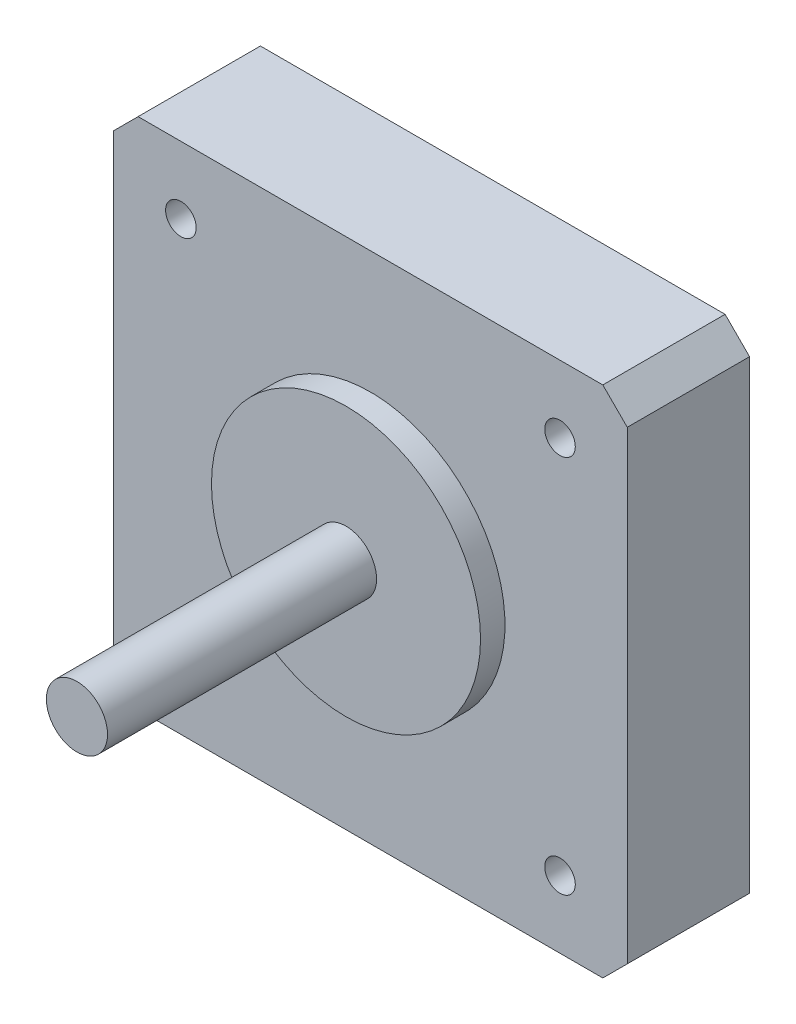
ISO-10303-21;
HEADER;
FILE_DESCRIPTION(('STEP AP214'),'2;1');
FILE_NAME('part.step','',(''),(''),'','','');
FILE_SCHEMA(('AUTOMOTIVE_DESIGN { 1 0 10303 214 1 1 1 1 }'));
ENDSEC;
DATA;
#1=APPLICATION_CONTEXT('core data for automotive mechanical design processes');
#2=APPLICATION_PROTOCOL_DEFINITION('international standard','automotive_design',2000,#1);
#3=PRODUCT_CONTEXT('',#1,'mechanical');
#4=PRODUCT('Part','Part','',(#3));
#5=PRODUCT_RELATED_PRODUCT_CATEGORY('part','',(#4));
#6=PRODUCT_DEFINITION_FORMATION('','',#4);
#7=PRODUCT_DEFINITION_CONTEXT('part definition',#1,'design');
#8=PRODUCT_DEFINITION('design','',#6,#7);
#9=PRODUCT_DEFINITION_SHAPE('','',#8);
#10=(LENGTH_UNIT() NAMED_UNIT(*) SI_UNIT(.MILLI.,.METRE.));
#11=(NAMED_UNIT(*) PLANE_ANGLE_UNIT() SI_UNIT($,.RADIAN.));
#12=(NAMED_UNIT(*) SI_UNIT($,.STERADIAN.) SOLID_ANGLE_UNIT());
#13=UNCERTAINTY_MEASURE_WITH_UNIT(LENGTH_MEASURE(1.E-05),#10,'distance_accuracy_value','');
#14=(GEOMETRIC_REPRESENTATION_CONTEXT(3) GLOBAL_UNCERTAINTY_ASSIGNED_CONTEXT((#13)) GLOBAL_UNIT_ASSIGNED_CONTEXT((#10,
#11,#12)) REPRESENTATION_CONTEXT('',''));
#15=CARTESIAN_POINT('',(0.,0.,0.));
#16=DIRECTION('',(0.,0.,1.));
#17=DIRECTION('',(1.,0.,0.));
#18=AXIS2_PLACEMENT_3D('',#15,#16,#17);
#19=CARTESIAN_POINT('',(0.,0.,10.));
#20=DIRECTION('',(0.,0.,-1.));
#21=DIRECTION('',(-1.,0.,0.));
#22=AXIS2_PLACEMENT_3D('',#19,#20,#21);
#23=PLANE('',#22);
#24=CARTESIAN_POINT('',(-15.4999999999998,15.5000000000002,10.));
#25=DIRECTION('',(0.,0.,1.));
#26=DIRECTION('',(1.,0.,0.));
#27=AXIS2_PLACEMENT_3D('',#24,#25,#26);
#28=CIRCLE('',#27,1.25);
#29=CARTESIAN_POINT('',(-14.2499999999998,15.5000000000002,10.));
#30=VERTEX_POINT('',#29);
#31=EDGE_CURVE('E127',#30,#30,#28,.T.);
#32=ORIENTED_EDGE('',*,*,#31,.F.);
#33=EDGE_LOOP('',(#32));
#34=FACE_BOUND('',#33,.T.);
#35=CARTESIAN_POINT('',(-15.5,-15.5,10.));
#36=DIRECTION('',(0.,0.,1.));
#37=DIRECTION('',(1.,0.,0.));
#38=AXIS2_PLACEMENT_3D('',#35,#36,#37);
#39=CIRCLE('',#38,1.25);
#40=CARTESIAN_POINT('',(-14.25,-15.5,10.));
#41=VERTEX_POINT('',#40);
#42=EDGE_CURVE('E126',#41,#41,#39,.T.);
#43=ORIENTED_EDGE('',*,*,#42,.F.);
#44=EDGE_LOOP('',(#43));
#45=FACE_BOUND('',#44,.T.);
#46=CARTESIAN_POINT('',(15.4999999999999,-15.5000000000001,10.));
#47=DIRECTION('',(0.,0.,1.));
#48=DIRECTION('',(1.,0.,0.));
#49=AXIS2_PLACEMENT_3D('',#46,#47,#48);
#50=CIRCLE('',#49,1.25);
#51=CARTESIAN_POINT('',(16.7499999999999,-15.5000000000001,10.));
#52=VERTEX_POINT('',#51);
#53=EDGE_CURVE('E137',#52,#52,#50,.T.);
#54=ORIENTED_EDGE('',*,*,#53,.F.);
#55=EDGE_LOOP('',(#54));
#56=FACE_BOUND('',#55,.T.);
#57=CARTESIAN_POINT('',(15.5,15.5,10.));
#58=DIRECTION('',(0.,0.,1.));
#59=DIRECTION('',(1.,0.,0.));
#60=AXIS2_PLACEMENT_3D('',#57,#58,#59);
#61=CIRCLE('',#60,1.25);
#62=CARTESIAN_POINT('',(16.75,15.5,10.));
#63=VERTEX_POINT('',#62);
#64=EDGE_CURVE('E143',#63,#63,#61,.T.);
#65=ORIENTED_EDGE('',*,*,#64,.F.);
#66=EDGE_LOOP('',(#65));
#67=FACE_BOUND('',#66,.T.);
#68=DIRECTION('',(0.,-1.,0.));
#69=VECTOR('',#68,1.);
#70=CARTESIAN_POINT('',(-21.,-21.,10.));
#71=LINE('',#70,#69);
#72=CARTESIAN_POINT('',(-21.,19.,10.));
#73=VERTEX_POINT('',#72);
#74=CARTESIAN_POINT('',(-21.,-19.,10.));
#75=VERTEX_POINT('',#74);
#76=EDGE_CURVE('E162',#73,#75,#71,.T.);
#77=ORIENTED_EDGE('',*,*,#76,.T.);
#78=DIRECTION('',(-0.707106781186545,0.70710678118655,0.));
#79=VECTOR('',#78,1.);
#80=CARTESIAN_POINT('',(-19.,-21.,10.));
#81=LINE('',#80,#79);
#82=CARTESIAN_POINT('',(-19.,-21.,10.));
#83=VERTEX_POINT('',#82);
#84=EDGE_CURVE('E205',#75,#83,#81,.F.);
#85=ORIENTED_EDGE('',*,*,#84,.T.);
#86=DIRECTION('',(1.,0.,0.));
#87=VECTOR('',#86,1.);
#88=CARTESIAN_POINT('',(-21.,-21.,10.));
#89=LINE('',#88,#87);
#90=CARTESIAN_POINT('',(19.,-21.,10.));
#91=VERTEX_POINT('',#90);
#92=EDGE_CURVE('E165',#83,#91,#89,.T.);
#93=ORIENTED_EDGE('',*,*,#92,.T.);
#94=DIRECTION('',(-0.70710678118655,-0.707106781186545,0.));
#95=VECTOR('',#94,1.);
#96=CARTESIAN_POINT('',(21.,-19.,10.));
#97=LINE('',#96,#95);
#98=CARTESIAN_POINT('',(21.,-19.,10.));
#99=VERTEX_POINT('',#98);
#100=EDGE_CURVE('E203',#91,#99,#97,.F.);
#101=ORIENTED_EDGE('',*,*,#100,.T.);
#102=DIRECTION('',(0.,1.,0.));
#103=VECTOR('',#102,1.);
#104=CARTESIAN_POINT('',(21.,-21.,10.));
#105=LINE('',#104,#103);
#106=CARTESIAN_POINT('',(21.,19.,10.));
#107=VERTEX_POINT('',#106);
#108=EDGE_CURVE('E157',#99,#107,#105,.T.);
#109=ORIENTED_EDGE('',*,*,#108,.T.);
#110=DIRECTION('',(0.707106781186545,-0.70710678118655,0.));
#111=VECTOR('',#110,1.);
#112=CARTESIAN_POINT('',(19.,21.,10.));
#113=LINE('',#112,#111);
#114=CARTESIAN_POINT('',(19.,21.,10.));
#115=VERTEX_POINT('',#114);
#116=EDGE_CURVE('E61',#107,#115,#113,.F.);
#117=ORIENTED_EDGE('',*,*,#116,.T.);
#118=DIRECTION('',(-1.,0.,0.));
#119=VECTOR('',#118,1.);
#120=CARTESIAN_POINT('',(-21.,21.,10.));
#121=LINE('',#120,#119);
#122=CARTESIAN_POINT('',(-19.,21.,10.));
#123=VERTEX_POINT('',#122);
#124=EDGE_CURVE('E159',#115,#123,#121,.T.);
#125=ORIENTED_EDGE('',*,*,#124,.T.);
#126=DIRECTION('',(0.70710678118655,0.707106781186545,0.));
#127=VECTOR('',#126,1.);
#128=CARTESIAN_POINT('',(-21.,19.,10.));
#129=LINE('',#128,#127);
#130=EDGE_CURVE('E201',#123,#73,#129,.F.);
#131=ORIENTED_EDGE('',*,*,#130,.T.);
#132=EDGE_LOOP('',(#77,#85,#93,#101,#109,#117,#125,#131));
#133=FACE_BOUND('',#132,.T.);
#134=CARTESIAN_POINT('',(0.,0.,10.));
#135=DIRECTION('',(0.,0.,-1.));
#136=DIRECTION('',(-1.,0.,0.));
#137=AXIS2_PLACEMENT_3D('',#134,#135,#136);
#138=CIRCLE('',#137,11.);
#139=CARTESIAN_POINT('',(-11.,0.,10.));
#140=VERTEX_POINT('',#139);
#141=EDGE_CURVE('E168',#140,#140,#138,.F.);
#142=ORIENTED_EDGE('',*,*,#141,.F.);
#143=EDGE_LOOP('',(#142));
#144=FACE_BOUND('',#143,.T.);
#145=ADVANCED_FACE('F41',(#34,#45,#56,#67,#133,#144),#23,.F.);
#146=CARTESIAN_POINT('',(21.,-21.,10.));
#147=DIRECTION('',(-1.,0.,0.));
#148=DIRECTION('',(0.,0.,1.));
#149=AXIS2_PLACEMENT_3D('',#146,#147,#148);
#150=PLANE('',#149);
#151=ORIENTED_EDGE('',*,*,#108,.F.);
#152=DIRECTION('',(0.,0.,-1.));
#153=VECTOR('',#152,1.);
#154=CARTESIAN_POINT('',(21.,-19.,10.));
#155=LINE('',#154,#153);
#156=CARTESIAN_POINT('',(21.,-19.,0.));
#157=VERTEX_POINT('',#156);
#158=EDGE_CURVE('E209',#99,#157,#155,.T.);
#159=ORIENTED_EDGE('',*,*,#158,.T.);
#160=DIRECTION('',(0.,1.,0.));
#161=VECTOR('',#160,1.);
#162=CARTESIAN_POINT('',(21.,-21.,0.));
#163=LINE('',#162,#161);
#164=CARTESIAN_POINT('',(21.,19.,0.));
#165=VERTEX_POINT('',#164);
#166=EDGE_CURVE('E156',#157,#165,#163,.T.);
#167=ORIENTED_EDGE('',*,*,#166,.T.);
#168=DIRECTION('',(0.,0.,1.));
#169=VECTOR('',#168,1.);
#170=CARTESIAN_POINT('',(21.,19.,10.));
#171=LINE('',#170,#169);
#172=EDGE_CURVE('E207',#165,#107,#171,.T.);
#173=ORIENTED_EDGE('',*,*,#172,.T.);
#174=EDGE_LOOP('',(#151,#159,#167,#173));
#175=FACE_BOUND('',#174,.T.);
#176=ADVANCED_FACE('F244',(#175),#150,.F.);
#177=CARTESIAN_POINT('',(-21.,21.,10.));
#178=DIRECTION('',(0.,-1.,0.));
#179=DIRECTION('',(0.,0.,-1.));
#180=AXIS2_PLACEMENT_3D('',#177,#178,#179);
#181=PLANE('',#180);
#182=DIRECTION('',(-1.,0.,0.));
#183=VECTOR('',#182,1.);
#184=CARTESIAN_POINT('',(-21.,21.,0.));
#185=LINE('',#184,#183);
#186=CARTESIAN_POINT('',(19.,21.,0.));
#187=VERTEX_POINT('',#186);
#188=CARTESIAN_POINT('',(-19.,21.,0.));
#189=VERTEX_POINT('',#188);
#190=EDGE_CURVE('E171',#187,#189,#185,.T.);
#191=ORIENTED_EDGE('',*,*,#190,.T.);
#192=DIRECTION('',(0.,0.,1.));
#193=VECTOR('',#192,1.);
#194=CARTESIAN_POINT('',(-19.,21.,10.));
#195=LINE('',#194,#193);
#196=EDGE_CURVE('E11',#189,#123,#195,.T.);
#197=ORIENTED_EDGE('',*,*,#196,.T.);
#198=ORIENTED_EDGE('',*,*,#124,.F.);
#199=DIRECTION('',(0.,0.,-1.));
#200=VECTOR('',#199,1.);
#201=CARTESIAN_POINT('',(19.,21.,10.));
#202=LINE('',#201,#200);
#203=EDGE_CURVE('E49',#115,#187,#202,.T.);
#204=ORIENTED_EDGE('',*,*,#203,.T.);
#205=EDGE_LOOP('',(#191,#197,#198,#204));
#206=FACE_BOUND('',#205,.T.);
#207=ADVANCED_FACE('F214',(#206),#181,.F.);
#208=CARTESIAN_POINT('',(-21.,-21.,10.));
#209=DIRECTION('',(1.,0.,0.));
#210=DIRECTION('',(0.,0.,-1.));
#211=AXIS2_PLACEMENT_3D('',#208,#209,#210);
#212=PLANE('',#211);
#213=DIRECTION('',(0.,-1.,0.));
#214=VECTOR('',#213,1.);
#215=CARTESIAN_POINT('',(-21.,-21.,0.));
#216=LINE('',#215,#214);
#217=CARTESIAN_POINT('',(-21.,19.,0.));
#218=VERTEX_POINT('',#217);
#219=CARTESIAN_POINT('',(-21.,-19.,0.));
#220=VERTEX_POINT('',#219);
#221=EDGE_CURVE('E173',#218,#220,#216,.T.);
#222=ORIENTED_EDGE('',*,*,#221,.T.);
#223=DIRECTION('',(0.,0.,1.));
#224=VECTOR('',#223,1.);
#225=CARTESIAN_POINT('',(-21.,-19.,10.));
#226=LINE('',#225,#224);
#227=EDGE_CURVE('E198',#220,#75,#226,.T.);
#228=ORIENTED_EDGE('',*,*,#227,.T.);
#229=ORIENTED_EDGE('',*,*,#76,.F.);
#230=DIRECTION('',(0.,0.,-1.));
#231=VECTOR('',#230,1.);
#232=CARTESIAN_POINT('',(-21.,19.,10.));
#233=LINE('',#232,#231);
#234=EDGE_CURVE('E195',#73,#218,#233,.T.);
#235=ORIENTED_EDGE('',*,*,#234,.T.);
#236=EDGE_LOOP('',(#222,#228,#229,#235));
#237=FACE_BOUND('',#236,.T.);
#238=ADVANCED_FACE('F227',(#237),#212,.F.);
#239=CARTESIAN_POINT('',(-21.,-21.,10.));
#240=DIRECTION('',(0.,1.,0.));
#241=DIRECTION('',(0.,0.,1.));
#242=AXIS2_PLACEMENT_3D('',#239,#240,#241);
#243=PLANE('',#242);
#244=ORIENTED_EDGE('',*,*,#92,.F.);
#245=DIRECTION('',(0.,0.,-1.));
#246=VECTOR('',#245,1.);
#247=CARTESIAN_POINT('',(-19.,-21.,10.));
#248=LINE('',#247,#246);
#249=CARTESIAN_POINT('',(-19.,-21.,0.));
#250=VERTEX_POINT('',#249);
#251=EDGE_CURVE('E184',#83,#250,#248,.T.);
#252=ORIENTED_EDGE('',*,*,#251,.T.);
#253=DIRECTION('',(1.,0.,0.));
#254=VECTOR('',#253,1.);
#255=CARTESIAN_POINT('',(-21.,-21.,0.));
#256=LINE('',#255,#254);
#257=CARTESIAN_POINT('',(19.,-21.,0.));
#258=VERTEX_POINT('',#257);
#259=EDGE_CURVE('E160',#250,#258,#256,.T.);
#260=ORIENTED_EDGE('',*,*,#259,.T.);
#261=DIRECTION('',(0.,0.,1.));
#262=VECTOR('',#261,1.);
#263=CARTESIAN_POINT('',(19.,-21.,10.));
#264=LINE('',#263,#262);
#265=EDGE_CURVE('E182',#258,#91,#264,.T.);
#266=ORIENTED_EDGE('',*,*,#265,.T.);
#267=EDGE_LOOP('',(#244,#252,#260,#266));
#268=FACE_BOUND('',#267,.T.);
#269=ADVANCED_FACE('F236',(#268),#243,.F.);
#270=CARTESIAN_POINT('',(0.,0.,0.));
#271=DIRECTION('',(0.,0.,-1.));
#272=DIRECTION('',(-1.,0.,0.));
#273=AXIS2_PLACEMENT_3D('',#270,#271,#272);
#274=PLANE('',#273);
#275=ORIENTED_EDGE('',*,*,#259,.F.);
#276=DIRECTION('',(0.707106781186545,-0.70710678118655,0.));
#277=VECTOR('',#276,1.);
#278=CARTESIAN_POINT('',(-20.0000000000001,-19.9999999999999,0.));
#279=LINE('',#278,#277);
#280=EDGE_CURVE('E193',#250,#220,#279,.F.);
#281=ORIENTED_EDGE('',*,*,#280,.T.);
#282=ORIENTED_EDGE('',*,*,#221,.F.);
#283=DIRECTION('',(-0.70710678118655,-0.707106781186545,0.));
#284=VECTOR('',#283,1.);
#285=CARTESIAN_POINT('',(-19.9999999999999,20.0000000000001,0.));
#286=LINE('',#285,#284);
#287=EDGE_CURVE('E189',#218,#189,#286,.F.);
#288=ORIENTED_EDGE('',*,*,#287,.T.);
#289=ORIENTED_EDGE('',*,*,#190,.F.);
#290=DIRECTION('',(-0.707106781186545,0.70710678118655,0.));
#291=VECTOR('',#290,1.);
#292=CARTESIAN_POINT('',(20.0000000000001,19.9999999999999,0.));
#293=LINE('',#292,#291);
#294=EDGE_CURVE('E187',#187,#165,#293,.F.);
#295=ORIENTED_EDGE('',*,*,#294,.T.);
#296=ORIENTED_EDGE('',*,*,#166,.F.);
#297=DIRECTION('',(0.70710678118655,0.707106781186545,0.));
#298=VECTOR('',#297,1.);
#299=CARTESIAN_POINT('',(19.9999999999999,-20.0000000000001,0.));
#300=LINE('',#299,#298);
#301=EDGE_CURVE('E191',#157,#258,#300,.F.);
#302=ORIENTED_EDGE('',*,*,#301,.T.);
#303=EDGE_LOOP('',(#275,#281,#282,#288,#289,#295,#296,#302));
#304=FACE_BOUND('',#303,.T.);
#305=ADVANCED_FACE('F218',(#304),#274,.T.);
#306=CARTESIAN_POINT('',(0.,0.,12.));
#307=DIRECTION('',(0.,0.,1.));
#308=DIRECTION('',(1.,0.,0.));
#309=AXIS2_PLACEMENT_3D('',#306,#307,#308);
#310=PLANE('',#309);
#311=CARTESIAN_POINT('',(0.,0.,12.));
#312=DIRECTION('',(0.,0.,1.));
#313=DIRECTION('',(1.,0.,0.));
#314=AXIS2_PLACEMENT_3D('',#311,#312,#313);
#315=CIRCLE('',#314,11.);
#316=CARTESIAN_POINT('',(11.,0.,12.));
#317=VERTEX_POINT('',#316);
#318=EDGE_CURVE('E149',#317,#317,#315,.T.);
#319=ORIENTED_EDGE('',*,*,#318,.T.);
#320=EDGE_LOOP('',(#319));
#321=FACE_BOUND('',#320,.T.);
#322=CARTESIAN_POINT('',(0.,0.,12.));
#323=DIRECTION('',(0.,0.,1.));
#324=DIRECTION('',(1.,0.,0.));
#325=AXIS2_PLACEMENT_3D('',#322,#323,#324);
#326=CIRCLE('',#325,2.5);
#327=CARTESIAN_POINT('',(2.5,0.,12.));
#328=VERTEX_POINT('',#327);
#329=EDGE_CURVE('E152',#328,#328,#326,.T.);
#330=ORIENTED_EDGE('',*,*,#329,.F.);
#331=EDGE_LOOP('',(#330));
#332=FACE_BOUND('',#331,.T.);
#333=ADVANCED_FACE('F270',(#321,#332),#310,.T.);
#334=CARTESIAN_POINT('',(0.,0.,12.));
#335=DIRECTION('',(0.,0.,-1.));
#336=DIRECTION('',(-1.,0.,0.));
#337=AXIS2_PLACEMENT_3D('',#334,#335,#336);
#338=CYLINDRICAL_SURFACE('',#337,11.);
#339=ORIENTED_EDGE('',*,*,#318,.F.);
#340=EDGE_LOOP('',(#339));
#341=FACE_BOUND('',#340,.T.);
#342=ORIENTED_EDGE('',*,*,#141,.T.);
#343=EDGE_LOOP('',(#342));
#344=FACE_BOUND('',#343,.T.);
#345=ADVANCED_FACE('F391',(#341,#344),#338,.T.);
#346=CARTESIAN_POINT('',(0.,0.,34.));
#347=DIRECTION('',(0.,0.,1.));
#348=DIRECTION('',(1.,0.,0.));
#349=AXIS2_PLACEMENT_3D('',#346,#347,#348);
#350=PLANE('',#349);
#351=CARTESIAN_POINT('',(0.,0.,34.));
#352=DIRECTION('',(0.,0.,1.));
#353=DIRECTION('',(1.,0.,0.));
#354=AXIS2_PLACEMENT_3D('',#351,#352,#353);
#355=CIRCLE('',#354,2.5);
#356=CARTESIAN_POINT('',(2.5,0.,34.));
#357=VERTEX_POINT('',#356);
#358=EDGE_CURVE('E153',#357,#357,#355,.T.);
#359=ORIENTED_EDGE('',*,*,#358,.T.);
#360=EDGE_LOOP('',(#359));
#361=FACE_BOUND('',#360,.T.);
#362=ADVANCED_FACE('F394',(#361),#350,.T.);
#363=CARTESIAN_POINT('',(0.,0.,34.));
#364=DIRECTION('',(0.,0.,-1.));
#365=DIRECTION('',(-1.,0.,0.));
#366=AXIS2_PLACEMENT_3D('',#363,#364,#365);
#367=CYLINDRICAL_SURFACE('',#366,2.5);
#368=ORIENTED_EDGE('',*,*,#329,.T.);
#369=EDGE_LOOP('',(#368));
#370=FACE_BOUND('',#369,.T.);
#371=ORIENTED_EDGE('',*,*,#358,.F.);
#372=EDGE_LOOP('',(#371));
#373=FACE_BOUND('',#372,.T.);
#374=ADVANCED_FACE('F266',(#370,#373),#367,.T.);
#375=CARTESIAN_POINT('',(-19.,-21.,10.));
#376=DIRECTION('',(0.70710678118655,0.707106781186545,0.));
#377=DIRECTION('',(0.,0.,-1.));
#378=AXIS2_PLACEMENT_3D('',#375,#376,#377);
#379=PLANE('',#378);
#380=ORIENTED_EDGE('',*,*,#84,.F.);
#381=ORIENTED_EDGE('',*,*,#227,.F.);
#382=ORIENTED_EDGE('',*,*,#280,.F.);
#383=ORIENTED_EDGE('',*,*,#251,.F.);
#384=EDGE_LOOP('',(#380,#381,#382,#383));
#385=FACE_BOUND('',#384,.T.);
#386=ADVANCED_FACE('F234',(#385),#379,.F.);
#387=CARTESIAN_POINT('',(21.,-19.,10.));
#388=DIRECTION('',(-0.707106781186545,0.70710678118655,0.));
#389=DIRECTION('',(0.,0.,-1.));
#390=AXIS2_PLACEMENT_3D('',#387,#388,#389);
#391=PLANE('',#390);
#392=ORIENTED_EDGE('',*,*,#100,.F.);
#393=ORIENTED_EDGE('',*,*,#265,.F.);
#394=ORIENTED_EDGE('',*,*,#301,.F.);
#395=ORIENTED_EDGE('',*,*,#158,.F.);
#396=EDGE_LOOP('',(#392,#393,#394,#395));
#397=FACE_BOUND('',#396,.T.);
#398=ADVANCED_FACE('F241',(#397),#391,.F.);
#399=CARTESIAN_POINT('',(-21.,19.,10.));
#400=DIRECTION('',(0.707106781186545,-0.70710678118655,0.));
#401=DIRECTION('',(0.,0.,-1.));
#402=AXIS2_PLACEMENT_3D('',#399,#400,#401);
#403=PLANE('',#402);
#404=ORIENTED_EDGE('',*,*,#130,.F.);
#405=ORIENTED_EDGE('',*,*,#196,.F.);
#406=ORIENTED_EDGE('',*,*,#287,.F.);
#407=ORIENTED_EDGE('',*,*,#234,.F.);
#408=EDGE_LOOP('',(#404,#405,#406,#407));
#409=FACE_BOUND('',#408,.T.);
#410=ADVANCED_FACE('F224',(#409),#403,.F.);
#411=CARTESIAN_POINT('',(19.,21.,10.));
#412=DIRECTION('',(-0.70710678118655,-0.707106781186545,0.));
#413=DIRECTION('',(0.,0.,-1.));
#414=AXIS2_PLACEMENT_3D('',#411,#412,#413);
#415=PLANE('',#414);
#416=ORIENTED_EDGE('',*,*,#116,.F.);
#417=ORIENTED_EDGE('',*,*,#172,.F.);
#418=ORIENTED_EDGE('',*,*,#294,.F.);
#419=ORIENTED_EDGE('',*,*,#203,.F.);
#420=EDGE_LOOP('',(#416,#417,#418,#419));
#421=FACE_BOUND('',#420,.T.);
#422=ADVANCED_FACE('F43',(#421),#415,.F.);
#423=CARTESIAN_POINT('',(15.5,15.5,2.5));
#424=DIRECTION('',(0.,0.,1.));
#425=DIRECTION('',(1.,0.,0.));
#426=AXIS2_PLACEMENT_3D('',#423,#424,#425);
#427=CONICAL_SURFACE('',#426,1.25,1.02974425867665);
#428=CARTESIAN_POINT('',(15.5,15.5,1.74892422621555));
#429=VERTEX_POINT('',#428);
#430=VERTEX_LOOP('',#429);
#431=FACE_BOUND('',#430,.T.);
#432=CARTESIAN_POINT('',(15.5,15.5,2.5));
#433=DIRECTION('',(0.,0.,1.));
#434=DIRECTION('',(1.,0.,0.));
#435=AXIS2_PLACEMENT_3D('',#432,#433,#434);
#436=CIRCLE('',#435,1.25);
#437=CARTESIAN_POINT('',(16.75,15.5,2.5));
#438=VERTEX_POINT('',#437);
#439=EDGE_CURVE('E146',#438,#438,#436,.T.);
#440=ORIENTED_EDGE('',*,*,#439,.T.);
#441=EDGE_LOOP('',(#440));
#442=FACE_BOUND('',#441,.T.);
#443=ADVANCED_FACE('F247',(#431,#442),#427,.F.);
#444=CARTESIAN_POINT('',(15.5,15.5,10.));
#445=DIRECTION('',(0.,0.,1.));
#446=DIRECTION('',(1.,0.,0.));
#447=AXIS2_PLACEMENT_3D('',#444,#445,#446);
#448=CYLINDRICAL_SURFACE('',#447,1.25);
#449=ORIENTED_EDGE('',*,*,#439,.F.);
#450=EDGE_LOOP('',(#449));
#451=FACE_BOUND('',#450,.T.);
#452=ORIENTED_EDGE('',*,*,#64,.T.);
#453=EDGE_LOOP('',(#452));
#454=FACE_BOUND('',#453,.T.);
#455=ADVANCED_FACE('F252',(#451,#454),#448,.F.);
#456=CARTESIAN_POINT('',(15.4999999999999,-15.5000000000001,2.5));
#457=DIRECTION('',(0.,0.,1.));
#458=DIRECTION('',(1.,0.,0.));
#459=AXIS2_PLACEMENT_3D('',#456,#457,#458);
#460=CONICAL_SURFACE('',#459,1.25,1.02974425867665);
#461=CARTESIAN_POINT('',(15.4999999999999,-15.5000000000001,1.74892422621555));
#462=VERTEX_POINT('',#461);
#463=VERTEX_LOOP('',#462);
#464=FACE_BOUND('',#463,.T.);
#465=CARTESIAN_POINT('',(15.4999999999999,-15.5000000000001,2.5));
#466=DIRECTION('',(0.,0.,1.));
#467=DIRECTION('',(1.,0.,0.));
#468=AXIS2_PLACEMENT_3D('',#465,#466,#467);
#469=CIRCLE('',#468,1.25);
#470=CARTESIAN_POINT('',(16.7499999999999,-15.5000000000001,2.5));
#471=VERTEX_POINT('',#470);
#472=EDGE_CURVE('E140',#471,#471,#469,.T.);
#473=ORIENTED_EDGE('',*,*,#472,.T.);
#474=EDGE_LOOP('',(#473));
#475=FACE_BOUND('',#474,.T.);
#476=ADVANCED_FACE('F308',(#464,#475),#460,.F.);
#477=CARTESIAN_POINT('',(15.4999999999999,-15.5000000000001,10.));
#478=DIRECTION('',(0.,0.,1.));
#479=DIRECTION('',(1.,0.,0.));
#480=AXIS2_PLACEMENT_3D('',#477,#478,#479);
#481=CYLINDRICAL_SURFACE('',#480,1.25);
#482=ORIENTED_EDGE('',*,*,#472,.F.);
#483=EDGE_LOOP('',(#482));
#484=FACE_BOUND('',#483,.T.);
#485=ORIENTED_EDGE('',*,*,#53,.T.);
#486=EDGE_LOOP('',(#485));
#487=FACE_BOUND('',#486,.T.);
#488=ADVANCED_FACE('F327',(#484,#487),#481,.F.);
#489=CARTESIAN_POINT('',(-15.5,-15.5,2.5));
#490=DIRECTION('',(0.,0.,1.));
#491=DIRECTION('',(1.,0.,0.));
#492=AXIS2_PLACEMENT_3D('',#489,#490,#491);
#493=CONICAL_SURFACE('',#492,1.25,1.02974425867665);
#494=CARTESIAN_POINT('',(-15.5,-15.5,1.74892422621555));
#495=VERTEX_POINT('',#494);
#496=VERTEX_LOOP('',#495);
#497=FACE_BOUND('',#496,.T.);
#498=CARTESIAN_POINT('',(-15.5,-15.5,2.5));
#499=DIRECTION('',(0.,0.,1.));
#500=DIRECTION('',(1.,0.,0.));
#501=AXIS2_PLACEMENT_3D('',#498,#499,#500);
#502=CIRCLE('',#501,1.25);
#503=CARTESIAN_POINT('',(-14.25,-15.5,2.5));
#504=VERTEX_POINT('',#503);
#505=EDGE_CURVE('E130',#504,#504,#502,.T.);
#506=ORIENTED_EDGE('',*,*,#505,.T.);
#507=EDGE_LOOP('',(#506));
#508=FACE_BOUND('',#507,.T.);
#509=ADVANCED_FACE('F338',(#497,#508),#493,.F.);
#510=CARTESIAN_POINT('',(-15.5,-15.5,10.));
#511=DIRECTION('',(0.,0.,1.));
#512=DIRECTION('',(1.,0.,0.));
#513=AXIS2_PLACEMENT_3D('',#510,#511,#512);
#514=CYLINDRICAL_SURFACE('',#513,1.25);
#515=ORIENTED_EDGE('',*,*,#505,.F.);
#516=EDGE_LOOP('',(#515));
#517=FACE_BOUND('',#516,.T.);
#518=ORIENTED_EDGE('',*,*,#42,.T.);
#519=EDGE_LOOP('',(#518));
#520=FACE_BOUND('',#519,.T.);
#521=ADVANCED_FACE('F120',(#517,#520),#514,.F.);
#522=CARTESIAN_POINT('',(-15.4999999999998,15.5000000000002,2.5));
#523=DIRECTION('',(0.,0.,1.));
#524=DIRECTION('',(1.,0.,0.));
#525=AXIS2_PLACEMENT_3D('',#522,#523,#524);
#526=CONICAL_SURFACE('',#525,1.25,1.02974425867665);
#527=CARTESIAN_POINT('',(-15.4999999999998,15.5000000000002,1.74892422621555));
#528=VERTEX_POINT('',#527);
#529=VERTEX_LOOP('',#528);
#530=FACE_BOUND('',#529,.T.);
#531=CARTESIAN_POINT('',(-15.4999999999998,15.5000000000002,2.5));
#532=DIRECTION('',(0.,0.,1.));
#533=DIRECTION('',(1.,0.,0.));
#534=AXIS2_PLACEMENT_3D('',#531,#532,#533);
#535=CIRCLE('',#534,1.25);
#536=CARTESIAN_POINT('',(-14.2499999999998,15.5000000000002,2.5));
#537=VERTEX_POINT('',#536);
#538=EDGE_CURVE('E124',#537,#537,#535,.T.);
#539=ORIENTED_EDGE('',*,*,#538,.T.);
#540=EDGE_LOOP('',(#539));
#541=FACE_BOUND('',#540,.T.);
#542=ADVANCED_FACE('F116',(#530,#541),#526,.F.);
#543=CARTESIAN_POINT('',(-15.4999999999998,15.5000000000002,10.));
#544=DIRECTION('',(0.,0.,1.));
#545=DIRECTION('',(1.,0.,0.));
#546=AXIS2_PLACEMENT_3D('',#543,#544,#545);
#547=CYLINDRICAL_SURFACE('',#546,1.25);
#548=ORIENTED_EDGE('',*,*,#538,.F.);
#549=EDGE_LOOP('',(#548));
#550=FACE_BOUND('',#549,.T.);
#551=ORIENTED_EDGE('',*,*,#31,.T.);
#552=EDGE_LOOP('',(#551));
#553=FACE_BOUND('',#552,.T.);
#554=ADVANCED_FACE('F119',(#550,#553),#547,.F.);
#555=CLOSED_SHELL('',(#145,#176,#207,#238,#269,#305,#333,#345,#362,#374,#386,#398,#410,#422,
#443,#455,#476,#488,#509,#521,#542,#554));
#556=MANIFOLD_SOLID_BREP('B2',#555);
#557=ADVANCED_BREP_SHAPE_REPRESENTATION('',(#18,#556),#14);
#558=SHAPE_DEFINITION_REPRESENTATION(#9,#557);
ENDSEC;
END-ISO-10303-21;
